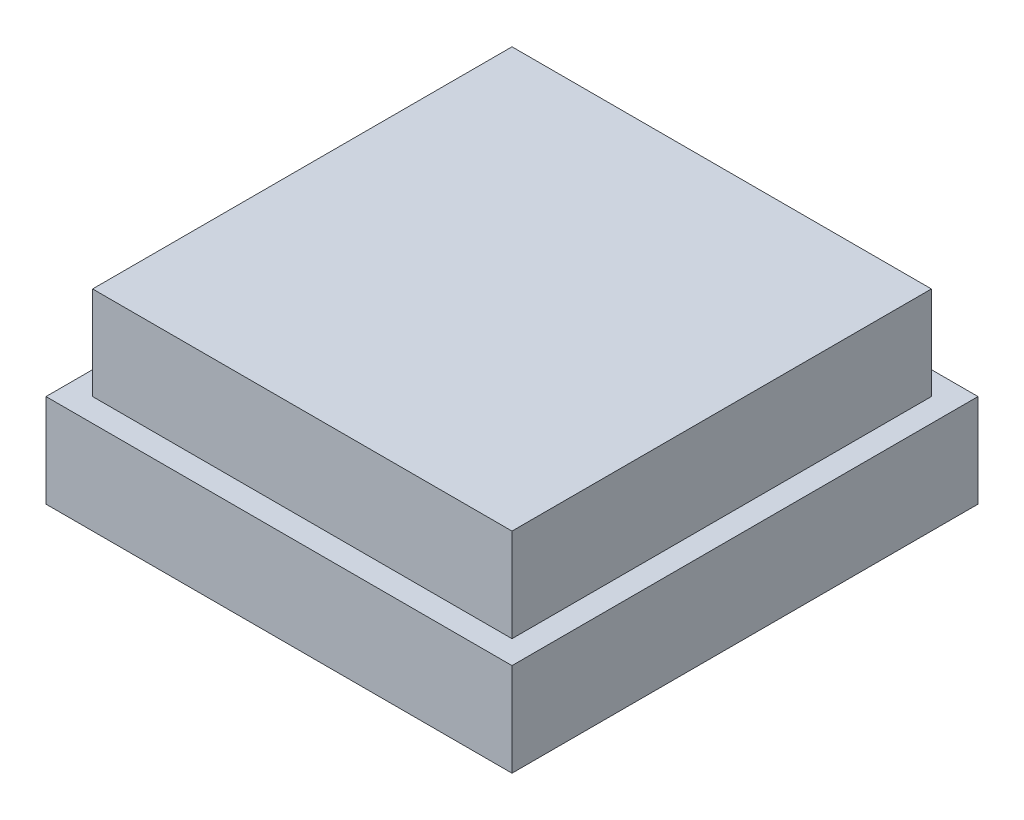
ISO-10303-21;
HEADER;
FILE_DESCRIPTION(('STEP AP214'),'2;1');
FILE_NAME('part.step','',(''),(''),'','','');
FILE_SCHEMA(('AUTOMOTIVE_DESIGN { 1 0 10303 214 1 1 1 1 }'));
ENDSEC;
DATA;
#1=APPLICATION_CONTEXT('core data for automotive mechanical design processes');
#2=APPLICATION_PROTOCOL_DEFINITION('international standard','automotive_design',2000,#1);
#3=PRODUCT_CONTEXT('',#1,'mechanical');
#4=PRODUCT('Part','Part','',(#3));
#5=PRODUCT_RELATED_PRODUCT_CATEGORY('part','',(#4));
#6=PRODUCT_DEFINITION_FORMATION('','',#4);
#7=PRODUCT_DEFINITION_CONTEXT('part definition',#1,'design');
#8=PRODUCT_DEFINITION('design','',#6,#7);
#9=PRODUCT_DEFINITION_SHAPE('','',#8);
#10=(LENGTH_UNIT() NAMED_UNIT(*) SI_UNIT(.MILLI.,.METRE.));
#11=(NAMED_UNIT(*) PLANE_ANGLE_UNIT() SI_UNIT($,.RADIAN.));
#12=(NAMED_UNIT(*) SI_UNIT($,.STERADIAN.) SOLID_ANGLE_UNIT());
#13=UNCERTAINTY_MEASURE_WITH_UNIT(LENGTH_MEASURE(1.E-05),#10,'distance_accuracy_value','');
#14=(GEOMETRIC_REPRESENTATION_CONTEXT(3) GLOBAL_UNCERTAINTY_ASSIGNED_CONTEXT((#13)) GLOBAL_UNIT_ASSIGNED_CONTEXT((#10,
#11,#12)) REPRESENTATION_CONTEXT('',''));
#15=CARTESIAN_POINT('',(0.,0.,0.));
#16=DIRECTION('',(0.,0.,1.));
#17=DIRECTION('',(1.,0.,0.));
#18=AXIS2_PLACEMENT_3D('',#15,#16,#17);
#19=CARTESIAN_POINT('',(0.,10.,0.));
#20=DIRECTION('',(0.,-1.,0.));
#21=DIRECTION('',(0.,0.,-1.));
#22=AXIS2_PLACEMENT_3D('',#19,#20,#21);
#23=PLANE('',#22);
#24=DIRECTION('',(1.,0.,0.));
#25=VECTOR('',#24,1.);
#26=CARTESIAN_POINT('',(-25.,10.,25.));
#27=LINE('',#26,#25);
#28=CARTESIAN_POINT('',(-25.,10.,25.));
#29=VERTEX_POINT('',#28);
#30=CARTESIAN_POINT('',(25.,10.,25.));
#31=VERTEX_POINT('',#30);
#32=EDGE_CURVE('E145',#29,#31,#27,.T.);
#33=ORIENTED_EDGE('',*,*,#32,.T.);
#34=DIRECTION('',(0.,0.,1.));
#35=VECTOR('',#34,1.);
#36=CARTESIAN_POINT('',(25.,10.,-25.));
#37=LINE('',#36,#35);
#38=CARTESIAN_POINT('',(25.,10.,-25.));
#39=VERTEX_POINT('',#38);
#40=EDGE_CURVE('E148',#39,#31,#37,.T.);
#41=ORIENTED_EDGE('',*,*,#40,.F.);
#42=DIRECTION('',(1.,0.,0.));
#43=VECTOR('',#42,1.);
#44=CARTESIAN_POINT('',(-25.,10.,-25.));
#45=LINE('',#44,#43);
#46=CARTESIAN_POINT('',(-25.,10.,-25.));
#47=VERTEX_POINT('',#46);
#48=EDGE_CURVE('E153',#47,#39,#45,.T.);
#49=ORIENTED_EDGE('',*,*,#48,.F.);
#50=DIRECTION('',(0.,0.,1.));
#51=VECTOR('',#50,1.);
#52=CARTESIAN_POINT('',(-25.,10.,-25.));
#53=LINE('',#52,#51);
#54=EDGE_CURVE('E157',#47,#29,#53,.T.);
#55=ORIENTED_EDGE('',*,*,#54,.T.);
#56=EDGE_LOOP('',(#33,#41,#49,#55));
#57=FACE_BOUND('',#56,.T.);
#58=DIRECTION('',(0.,0.,1.));
#59=VECTOR('',#58,1.);
#60=CARTESIAN_POINT('',(-22.5,10.,-22.5));
#61=LINE('',#60,#59);
#62=CARTESIAN_POINT('',(-22.5,10.,-22.5));
#63=VERTEX_POINT('',#62);
#64=CARTESIAN_POINT('',(-22.5,10.,22.5));
#65=VERTEX_POINT('',#64);
#66=EDGE_CURVE('E61',#63,#65,#61,.T.);
#67=ORIENTED_EDGE('',*,*,#66,.F.);
#68=DIRECTION('',(1.,0.,0.));
#69=VECTOR('',#68,1.);
#70=CARTESIAN_POINT('',(-22.5,10.,-22.5));
#71=LINE('',#70,#69);
#72=CARTESIAN_POINT('',(22.5,10.,-22.5));
#73=VERTEX_POINT('',#72);
#74=EDGE_CURVE('E66',#63,#73,#71,.T.);
#75=ORIENTED_EDGE('',*,*,#74,.T.);
#76=DIRECTION('',(0.,0.,1.));
#77=VECTOR('',#76,1.);
#78=CARTESIAN_POINT('',(22.5,10.,-22.5));
#79=LINE('',#78,#77);
#80=CARTESIAN_POINT('',(22.5,10.,22.5));
#81=VERTEX_POINT('',#80);
#82=EDGE_CURVE('E282',#73,#81,#79,.T.);
#83=ORIENTED_EDGE('',*,*,#82,.T.);
#84=DIRECTION('',(1.,0.,0.));
#85=VECTOR('',#84,1.);
#86=CARTESIAN_POINT('',(-22.5,10.,22.5));
#87=LINE('',#86,#85);
#88=EDGE_CURVE('E285',#65,#81,#87,.T.);
#89=ORIENTED_EDGE('',*,*,#88,.F.);
#90=EDGE_LOOP('',(#67,#75,#83,#89));
#91=FACE_BOUND('',#90,.T.);
#92=ADVANCED_FACE('F45',(#57,#91),#23,.F.);
#93=CARTESIAN_POINT('',(-25.,10.,25.));
#94=DIRECTION('',(0.,0.,-1.));
#95=DIRECTION('',(-1.,0.,0.));
#96=AXIS2_PLACEMENT_3D('',#93,#94,#95);
#97=PLANE('',#96);
#98=DIRECTION('',(1.,0.,0.));
#99=VECTOR('',#98,1.);
#100=CARTESIAN_POINT('',(-25.,0.,25.));
#101=LINE('',#100,#99);
#102=CARTESIAN_POINT('',(-25.,0.,25.));
#103=VERTEX_POINT('',#102);
#104=CARTESIAN_POINT('',(25.,0.,25.));
#105=VERTEX_POINT('',#104);
#106=EDGE_CURVE('E134',#103,#105,#101,.T.);
#107=ORIENTED_EDGE('',*,*,#106,.T.);
#108=DIRECTION('',(0.,-1.,0.));
#109=VECTOR('',#108,1.);
#110=CARTESIAN_POINT('',(25.,10.,25.));
#111=LINE('',#110,#109);
#112=EDGE_CURVE('E11',#31,#105,#111,.T.);
#113=ORIENTED_EDGE('',*,*,#112,.F.);
#114=ORIENTED_EDGE('',*,*,#32,.F.);
#115=DIRECTION('',(0.,-1.,0.));
#116=VECTOR('',#115,1.);
#117=CARTESIAN_POINT('',(-25.,10.,25.));
#118=LINE('',#117,#116);
#119=EDGE_CURVE('E159',#29,#103,#118,.T.);
#120=ORIENTED_EDGE('',*,*,#119,.T.);
#121=EDGE_LOOP('',(#107,#113,#114,#120));
#122=FACE_BOUND('',#121,.T.);
#123=ADVANCED_FACE('F47',(#122),#97,.F.);
#124=CARTESIAN_POINT('',(25.,10.,-25.));
#125=DIRECTION('',(1.,0.,0.));
#126=DIRECTION('',(0.,0.,-1.));
#127=AXIS2_PLACEMENT_3D('',#124,#125,#126);
#128=PLANE('',#127);
#129=DIRECTION('',(0.,0.,1.));
#130=VECTOR('',#129,1.);
#131=CARTESIAN_POINT('',(25.,0.,-25.));
#132=LINE('',#131,#130);
#133=CARTESIAN_POINT('',(25.,0.,-25.));
#134=VERTEX_POINT('',#133);
#135=EDGE_CURVE('E139',#134,#105,#132,.T.);
#136=ORIENTED_EDGE('',*,*,#135,.F.);
#137=DIRECTION('',(0.,-1.,0.));
#138=VECTOR('',#137,1.);
#139=CARTESIAN_POINT('',(25.,10.,-25.));
#140=LINE('',#139,#138);
#141=EDGE_CURVE('E54',#39,#134,#140,.T.);
#142=ORIENTED_EDGE('',*,*,#141,.F.);
#143=ORIENTED_EDGE('',*,*,#40,.T.);
#144=ORIENTED_EDGE('',*,*,#112,.T.);
#145=EDGE_LOOP('',(#136,#142,#143,#144));
#146=FACE_BOUND('',#145,.T.);
#147=ADVANCED_FACE('F183',(#146),#128,.T.);
#148=CARTESIAN_POINT('',(-25.,10.,-25.));
#149=DIRECTION('',(0.,0.,-1.));
#150=DIRECTION('',(-1.,0.,0.));
#151=AXIS2_PLACEMENT_3D('',#148,#149,#150);
#152=PLANE('',#151);
#153=DIRECTION('',(1.,0.,0.));
#154=VECTOR('',#153,1.);
#155=CARTESIAN_POINT('',(-25.,0.,-25.));
#156=LINE('',#155,#154);
#157=CARTESIAN_POINT('',(-25.,0.,-25.));
#158=VERTEX_POINT('',#157);
#159=EDGE_CURVE('E164',#158,#134,#156,.T.);
#160=ORIENTED_EDGE('',*,*,#159,.F.);
#161=DIRECTION('',(0.,-1.,0.));
#162=VECTOR('',#161,1.);
#163=CARTESIAN_POINT('',(-25.,10.,-25.));
#164=LINE('',#163,#162);
#165=EDGE_CURVE('E173',#47,#158,#164,.T.);
#166=ORIENTED_EDGE('',*,*,#165,.F.);
#167=ORIENTED_EDGE('',*,*,#48,.T.);
#168=ORIENTED_EDGE('',*,*,#141,.T.);
#169=EDGE_LOOP('',(#160,#166,#167,#168));
#170=FACE_BOUND('',#169,.T.);
#171=ADVANCED_FACE('F179',(#170),#152,.T.);
#172=CARTESIAN_POINT('',(-25.,10.,-25.));
#173=DIRECTION('',(1.,0.,0.));
#174=DIRECTION('',(0.,0.,-1.));
#175=AXIS2_PLACEMENT_3D('',#172,#173,#174);
#176=PLANE('',#175);
#177=DIRECTION('',(0.,0.,1.));
#178=VECTOR('',#177,1.);
#179=CARTESIAN_POINT('',(-25.,0.,-25.));
#180=LINE('',#179,#178);
#181=EDGE_CURVE('E149',#158,#103,#180,.T.);
#182=ORIENTED_EDGE('',*,*,#181,.T.);
#183=ORIENTED_EDGE('',*,*,#119,.F.);
#184=ORIENTED_EDGE('',*,*,#54,.F.);
#185=ORIENTED_EDGE('',*,*,#165,.T.);
#186=EDGE_LOOP('',(#182,#183,#184,#185));
#187=FACE_BOUND('',#186,.T.);
#188=ADVANCED_FACE('F191',(#187),#176,.F.);
#189=CARTESIAN_POINT('',(0.,0.,0.));
#190=DIRECTION('',(0.,-1.,0.));
#191=DIRECTION('',(0.,0.,-1.));
#192=AXIS2_PLACEMENT_3D('',#189,#190,#191);
#193=PLANE('',#192);
#194=ORIENTED_EDGE('',*,*,#106,.F.);
#195=ORIENTED_EDGE('',*,*,#181,.F.);
#196=ORIENTED_EDGE('',*,*,#159,.T.);
#197=ORIENTED_EDGE('',*,*,#135,.T.);
#198=EDGE_LOOP('',(#194,#195,#196,#197));
#199=FACE_BOUND('',#198,.T.);
#200=ADVANCED_FACE('F188',(#199),#193,.T.);
#201=CARTESIAN_POINT('',(-22.5,20.,-22.5));
#202=DIRECTION('',(1.,0.,0.));
#203=DIRECTION('',(0.,0.,-1.));
#204=AXIS2_PLACEMENT_3D('',#201,#202,#203);
#205=PLANE('',#204);
#206=ORIENTED_EDGE('',*,*,#66,.T.);
#207=DIRECTION('',(0.,-1.,0.));
#208=VECTOR('',#207,1.);
#209=CARTESIAN_POINT('',(-22.5,20.,22.5));
#210=LINE('',#209,#208);
#211=CARTESIAN_POINT('',(-22.5,20.,22.5));
#212=VERTEX_POINT('',#211);
#213=EDGE_CURVE('E114',#212,#65,#210,.T.);
#214=ORIENTED_EDGE('',*,*,#213,.F.);
#215=DIRECTION('',(0.,0.,1.));
#216=VECTOR('',#215,1.);
#217=CARTESIAN_POINT('',(-22.5,20.,-22.5));
#218=LINE('',#217,#216);
#219=CARTESIAN_POINT('',(-22.5,20.,-22.5));
#220=VERTEX_POINT('',#219);
#221=EDGE_CURVE('E122',#220,#212,#218,.T.);
#222=ORIENTED_EDGE('',*,*,#221,.F.);
#223=DIRECTION('',(0.,-1.,0.));
#224=VECTOR('',#223,1.);
#225=CARTESIAN_POINT('',(-22.5,20.,-22.5));
#226=LINE('',#225,#224);
#227=EDGE_CURVE('E279',#220,#63,#226,.T.);
#228=ORIENTED_EDGE('',*,*,#227,.T.);
#229=EDGE_LOOP('',(#206,#214,#222,#228));
#230=FACE_BOUND('',#229,.T.);
#231=ADVANCED_FACE('F132',(#230),#205,.F.);
#232=CARTESIAN_POINT('',(-22.5,20.,22.5));
#233=DIRECTION('',(0.,0.,-1.));
#234=DIRECTION('',(-1.,0.,0.));
#235=AXIS2_PLACEMENT_3D('',#232,#233,#234);
#236=PLANE('',#235);
#237=ORIENTED_EDGE('',*,*,#88,.T.);
#238=DIRECTION('',(0.,-1.,0.));
#239=VECTOR('',#238,1.);
#240=CARTESIAN_POINT('',(22.5,20.,22.5));
#241=LINE('',#240,#239);
#242=CARTESIAN_POINT('',(22.5,20.,22.5));
#243=VERTEX_POINT('',#242);
#244=EDGE_CURVE('E116',#243,#81,#241,.T.);
#245=ORIENTED_EDGE('',*,*,#244,.F.);
#246=DIRECTION('',(1.,0.,0.));
#247=VECTOR('',#246,1.);
#248=CARTESIAN_POINT('',(-22.5,20.,22.5));
#249=LINE('',#248,#247);
#250=EDGE_CURVE('E109',#212,#243,#249,.T.);
#251=ORIENTED_EDGE('',*,*,#250,.F.);
#252=ORIENTED_EDGE('',*,*,#213,.T.);
#253=EDGE_LOOP('',(#237,#245,#251,#252));
#254=FACE_BOUND('',#253,.T.);
#255=ADVANCED_FACE('F112',(#254),#236,.F.);
#256=CARTESIAN_POINT('',(22.5,20.,-22.5));
#257=DIRECTION('',(1.,0.,0.));
#258=DIRECTION('',(0.,0.,-1.));
#259=AXIS2_PLACEMENT_3D('',#256,#257,#258);
#260=PLANE('',#259);
#261=ORIENTED_EDGE('',*,*,#82,.F.);
#262=DIRECTION('',(0.,-1.,0.));
#263=VECTOR('',#262,1.);
#264=CARTESIAN_POINT('',(22.5,20.,-22.5));
#265=LINE('',#264,#263);
#266=CARTESIAN_POINT('',(22.5,20.,-22.5));
#267=VERTEX_POINT('',#266);
#268=EDGE_CURVE('E141',#267,#73,#265,.T.);
#269=ORIENTED_EDGE('',*,*,#268,.F.);
#270=DIRECTION('',(0.,0.,1.));
#271=VECTOR('',#270,1.);
#272=CARTESIAN_POINT('',(22.5,20.,-22.5));
#273=LINE('',#272,#271);
#274=EDGE_CURVE('E121',#267,#243,#273,.T.);
#275=ORIENTED_EDGE('',*,*,#274,.T.);
#276=ORIENTED_EDGE('',*,*,#244,.T.);
#277=EDGE_LOOP('',(#261,#269,#275,#276));
#278=FACE_BOUND('',#277,.T.);
#279=ADVANCED_FACE('F250',(#278),#260,.T.);
#280=CARTESIAN_POINT('',(-22.5,20.,-22.5));
#281=DIRECTION('',(0.,0.,-1.));
#282=DIRECTION('',(-1.,0.,0.));
#283=AXIS2_PLACEMENT_3D('',#280,#281,#282);
#284=PLANE('',#283);
#285=ORIENTED_EDGE('',*,*,#74,.F.);
#286=ORIENTED_EDGE('',*,*,#227,.F.);
#287=DIRECTION('',(1.,0.,0.));
#288=VECTOR('',#287,1.);
#289=CARTESIAN_POINT('',(-22.5,20.,-22.5));
#290=LINE('',#289,#288);
#291=EDGE_CURVE('E128',#220,#267,#290,.T.);
#292=ORIENTED_EDGE('',*,*,#291,.T.);
#293=ORIENTED_EDGE('',*,*,#268,.T.);
#294=EDGE_LOOP('',(#285,#286,#292,#293));
#295=FACE_BOUND('',#294,.T.);
#296=ADVANCED_FACE('F258',(#295),#284,.T.);
#297=CARTESIAN_POINT('',(0.,20.,0.));
#298=DIRECTION('',(0.,1.,0.));
#299=DIRECTION('',(0.,0.,1.));
#300=AXIS2_PLACEMENT_3D('',#297,#298,#299);
#301=PLANE('',#300);
#302=ORIENTED_EDGE('',*,*,#221,.T.);
#303=ORIENTED_EDGE('',*,*,#250,.T.);
#304=ORIENTED_EDGE('',*,*,#274,.F.);
#305=ORIENTED_EDGE('',*,*,#291,.F.);
#306=EDGE_LOOP('',(#302,#303,#304,#305));
#307=FACE_BOUND('',#306,.T.);
#308=ADVANCED_FACE('F126',(#307),#301,.T.);
#309=CLOSED_SHELL('',(#92,#123,#147,#171,#188,#200,#231,#255,#279,#296,#308));
#310=MANIFOLD_SOLID_BREP('B2',#309);
#311=ADVANCED_BREP_SHAPE_REPRESENTATION('',(#18,#310),#14);
#312=SHAPE_DEFINITION_REPRESENTATION(#9,#311);
ENDSEC;
END-ISO-10303-21;
